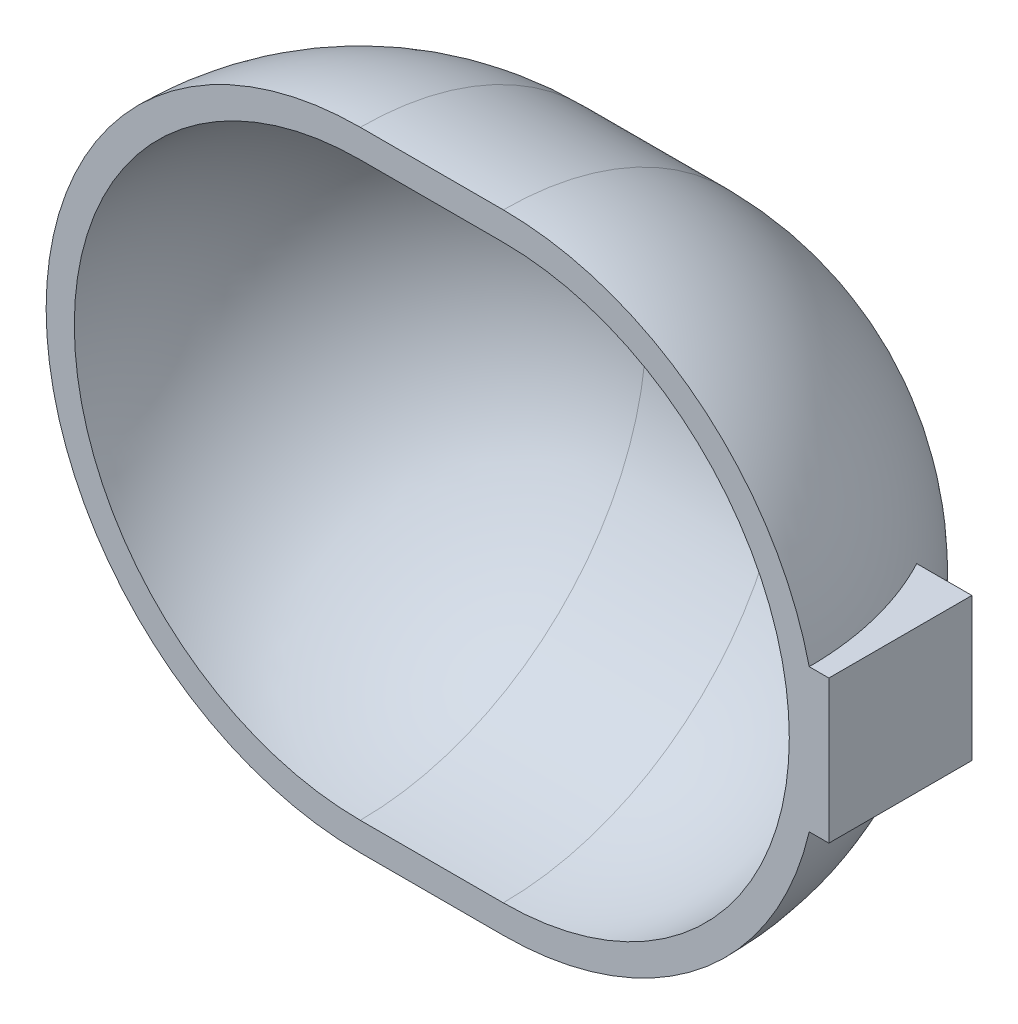
ISO-10303-21;
HEADER;
FILE_DESCRIPTION(('STEP AP214'),'2;1');
FILE_NAME('part.step','',(''),(''),'','','');
FILE_SCHEMA(('AUTOMOTIVE_DESIGN { 1 0 10303 214 1 1 1 1 }'));
ENDSEC;
DATA;
#1=APPLICATION_CONTEXT('core data for automotive mechanical design processes');
#2=APPLICATION_PROTOCOL_DEFINITION('international standard','automotive_design',2000,#1);
#3=PRODUCT_CONTEXT('',#1,'mechanical');
#4=PRODUCT('Part','Part','',(#3));
#5=PRODUCT_RELATED_PRODUCT_CATEGORY('part','',(#4));
#6=PRODUCT_DEFINITION_FORMATION('','',#4);
#7=PRODUCT_DEFINITION_CONTEXT('part definition',#1,'design');
#8=PRODUCT_DEFINITION('design','',#6,#7);
#9=PRODUCT_DEFINITION_SHAPE('','',#8);
#10=(LENGTH_UNIT() NAMED_UNIT(*) SI_UNIT(.MILLI.,.METRE.));
#11=(NAMED_UNIT(*) PLANE_ANGLE_UNIT() SI_UNIT($,.RADIAN.));
#12=(NAMED_UNIT(*) SI_UNIT($,.STERADIAN.) SOLID_ANGLE_UNIT());
#13=UNCERTAINTY_MEASURE_WITH_UNIT(LENGTH_MEASURE(1.E-05),#10,'distance_accuracy_value','');
#14=(GEOMETRIC_REPRESENTATION_CONTEXT(3) GLOBAL_UNCERTAINTY_ASSIGNED_CONTEXT((#13)) GLOBAL_UNIT_ASSIGNED_CONTEXT((#10,
#11,#12)) REPRESENTATION_CONTEXT('',''));
#15=CARTESIAN_POINT('',(0.,0.,0.));
#16=DIRECTION('',(0.,0.,1.));
#17=DIRECTION('',(1.,0.,0.));
#18=AXIS2_PLACEMENT_3D('',#15,#16,#17);
#19=CARTESIAN_POINT('',(533.,0.,0.));
#20=DIRECTION('',(-1.,0.,0.));
#21=DIRECTION('',(0.,1.,0.));
#22=AXIS2_PLACEMENT_3D('',#19,#20,#21);
#23=SPHERICAL_SURFACE('',#22,558.);
#24=CARTESIAN_POINT('',(533.,-127.,0.));
#25=DIRECTION('',(0.,-1.,0.));
#26=DIRECTION('',(0.,0.,-1.));
#27=AXIS2_PLACEMENT_3D('',#24,#25,#26);
#28=CIRCLE('',#27,543.355316528697);
#29=CARTESIAN_POINT('',(1013.33217672773,-127.,-254.));
#30=VERTEX_POINT('',#29);
#31=CARTESIAN_POINT('',(1076.3553165287,-127.,-8.86836260066156E-13));
#32=VERTEX_POINT('',#31);
#33=EDGE_CURVE('E125',#30,#32,#28,.T.);
#34=ORIENTED_EDGE('',*,*,#33,.T.);
#35=CARTESIAN_POINT('',(533.,0.,0.));
#36=DIRECTION('',(0.,0.,-1.));
#37=DIRECTION('',(1.,0.,0.));
#38=AXIS2_PLACEMENT_3D('',#35,#36,#37);
#39=CIRCLE('',#38,558.);
#40=CARTESIAN_POINT('',(533.,-558.,0.));
#41=VERTEX_POINT('',#40);
#42=EDGE_CURVE('E155',#32,#41,#39,.T.);
#43=ORIENTED_EDGE('',*,*,#42,.T.);
#44=CARTESIAN_POINT('',(533.,0.,0.));
#45=DIRECTION('',(-1.,0.,0.));
#46=DIRECTION('',(0.,0.,1.));
#47=AXIS2_PLACEMENT_3D('',#44,#45,#46);
#48=CIRCLE('',#47,558.);
#49=CARTESIAN_POINT('',(533.,558.,3.89649317414894E-12));
#50=VERTEX_POINT('',#49);
#51=EDGE_CURVE('E45',#50,#41,#48,.T.);
#52=ORIENTED_EDGE('',*,*,#51,.F.);
#53=CARTESIAN_POINT('',(1076.3553165287,127.,8.86836260066156E-13));
#54=VERTEX_POINT('',#53);
#55=EDGE_CURVE('E156',#50,#54,#39,.T.);
#56=ORIENTED_EDGE('',*,*,#55,.T.);
#57=CARTESIAN_POINT('',(533.,127.,0.));
#58=DIRECTION('',(0.,1.,0.));
#59=DIRECTION('',(0.,0.,1.));
#60=AXIS2_PLACEMENT_3D('',#57,#58,#59);
#61=CIRCLE('',#60,543.355316528697);
#62=CARTESIAN_POINT('',(1013.33217672773,127.,-254.));
#63=VERTEX_POINT('',#62);
#64=EDGE_CURVE('E57',#54,#63,#61,.T.);
#65=ORIENTED_EDGE('',*,*,#64,.T.);
#66=CARTESIAN_POINT('',(533.,0.,-254.));
#67=DIRECTION('',(0.,0.,-1.));
#68=DIRECTION('',(0.,1.,0.));
#69=AXIS2_PLACEMENT_3D('',#66,#67,#68);
#70=CIRCLE('',#69,496.838001767176);
#71=EDGE_CURVE('E52',#63,#30,#70,.T.);
#72=ORIENTED_EDGE('',*,*,#71,.T.);
#73=EDGE_LOOP('',(#34,#43,#52,#56,#65,#72));
#74=FACE_BOUND('',#73,.T.);
#75=ADVANCED_FACE('F37',(#74),#23,.T.);
#76=CARTESIAN_POINT('',(279.,0.,0.));
#77=DIRECTION('',(-1.,0.,0.));
#78=DIRECTION('',(0.,-1.,0.));
#79=AXIS2_PLACEMENT_3D('',#76,#77,#78);
#80=SPHERICAL_SURFACE('',#79,558.);
#81=CARTESIAN_POINT('',(279.,0.,0.));
#82=DIRECTION('',(-1.,0.,0.));
#83=DIRECTION('',(0.,0.,1.));
#84=AXIS2_PLACEMENT_3D('',#81,#82,#83);
#85=CIRCLE('',#84,558.);
#86=CARTESIAN_POINT('',(279.,558.,3.89649317414894E-12));
#87=VERTEX_POINT('',#86);
#88=CARTESIAN_POINT('',(279.,-558.,0.));
#89=VERTEX_POINT('',#88);
#90=EDGE_CURVE('E11',#87,#89,#85,.T.);
#91=ORIENTED_EDGE('',*,*,#90,.T.);
#92=CARTESIAN_POINT('',(279.,0.,0.));
#93=DIRECTION('',(0.,0.,-1.));
#94=DIRECTION('',(1.,0.,0.));
#95=AXIS2_PLACEMENT_3D('',#92,#93,#94);
#96=CIRCLE('',#95,558.);
#97=EDGE_CURVE('E158',#89,#87,#96,.T.);
#98=ORIENTED_EDGE('',*,*,#97,.T.);
#99=EDGE_LOOP('',(#91,#98));
#100=FACE_BOUND('',#99,.T.);
#101=ADVANCED_FACE('F39',(#100),#80,.T.);
#102=CARTESIAN_POINT('',(533.,0.,0.));
#103=DIRECTION('',(-1.,0.,0.));
#104=DIRECTION('',(0.,0.,1.));
#105=AXIS2_PLACEMENT_3D('',#102,#103,#104);
#106=CYLINDRICAL_SURFACE('',#105,558.);
#107=DIRECTION('',(1.,0.,0.));
#108=VECTOR('',#107,1.);
#109=CARTESIAN_POINT('',(279.,558.,3.89649317414894E-12));
#110=LINE('',#109,#108);
#111=EDGE_CURVE('E161',#87,#50,#110,.T.);
#112=ORIENTED_EDGE('',*,*,#111,.T.);
#113=ORIENTED_EDGE('',*,*,#51,.T.);
#114=DIRECTION('',(1.,0.,0.));
#115=VECTOR('',#114,1.);
#116=CARTESIAN_POINT('',(279.,-558.,0.));
#117=LINE('',#116,#115);
#118=EDGE_CURVE('E142',#89,#41,#117,.T.);
#119=ORIENTED_EDGE('',*,*,#118,.F.);
#120=ORIENTED_EDGE('',*,*,#90,.F.);
#121=EDGE_LOOP('',(#112,#113,#119,#120));
#122=FACE_BOUND('',#121,.T.);
#123=ADVANCED_FACE('F166',(#122),#106,.T.);
#124=CARTESIAN_POINT('',(533.,0.,0.));
#125=DIRECTION('',(0.,0.,-1.));
#126=DIRECTION('',(1.,0.,0.));
#127=AXIS2_PLACEMENT_3D('',#124,#125,#126);
#128=PLANE('',#127);
#129=DIRECTION('',(-1.,0.,0.));
#130=VECTOR('',#129,1.);
#131=CARTESIAN_POINT('',(279.,508.,3.52786446705774E-12));
#132=LINE('',#131,#130);
#133=CARTESIAN_POINT('',(279.,508.,3.52786446705774E-12));
#134=VERTEX_POINT('',#133);
#135=CARTESIAN_POINT('',(533.,508.,3.54734504026462E-12));
#136=VERTEX_POINT('',#135);
#137=EDGE_CURVE('E140',#134,#136,#132,.F.);
#138=ORIENTED_EDGE('',*,*,#137,.T.);
#139=CARTESIAN_POINT('',(533.,0.,0.));
#140=DIRECTION('',(0.,0.,-1.));
#141=DIRECTION('',(0.,1.,0.));
#142=AXIS2_PLACEMENT_3D('',#139,#140,#141);
#143=CIRCLE('',#142,508.);
#144=CARTESIAN_POINT('',(533.,-508.,-2.25597318603832E-13));
#145=VERTEX_POINT('',#144);
#146=EDGE_CURVE('E143',#136,#145,#143,.T.);
#147=ORIENTED_EDGE('',*,*,#146,.T.);
#148=DIRECTION('',(-1.,0.,0.));
#149=VECTOR('',#148,1.);
#150=CARTESIAN_POINT('',(279.,-508.,0.));
#151=LINE('',#150,#149);
#152=CARTESIAN_POINT('',(279.,-508.,0.));
#153=VERTEX_POINT('',#152);
#154=EDGE_CURVE('E136',#153,#145,#151,.F.);
#155=ORIENTED_EDGE('',*,*,#154,.F.);
#156=CARTESIAN_POINT('',(279.,0.,0.));
#157=DIRECTION('',(0.,0.,-1.));
#158=DIRECTION('',(0.,1.,0.));
#159=AXIS2_PLACEMENT_3D('',#156,#157,#158);
#160=CIRCLE('',#159,508.);
#161=EDGE_CURVE('E146',#153,#134,#160,.T.);
#162=ORIENTED_EDGE('',*,*,#161,.T.);
#163=EDGE_LOOP('',(#138,#147,#155,#162));
#164=FACE_BOUND('',#163,.T.);
#165=ORIENTED_EDGE('',*,*,#55,.F.);
#166=ORIENTED_EDGE('',*,*,#111,.F.);
#167=ORIENTED_EDGE('',*,*,#97,.F.);
#168=ORIENTED_EDGE('',*,*,#118,.T.);
#169=ORIENTED_EDGE('',*,*,#42,.F.);
#170=DIRECTION('',(1.,0.,0.));
#171=VECTOR('',#170,1.);
#172=CARTESIAN_POINT('',(-279.001,-127.,0.));
#173=LINE('',#172,#171);
#174=CARTESIAN_POINT('',(1111.26,-127.,0.));
#175=VERTEX_POINT('',#174);
#176=EDGE_CURVE('E132',#32,#175,#173,.T.);
#177=ORIENTED_EDGE('',*,*,#176,.T.);
#178=DIRECTION('',(0.,-1.,0.));
#179=VECTOR('',#178,1.);
#180=CARTESIAN_POINT('',(1111.26,-127.,0.));
#181=LINE('',#180,#179);
#182=CARTESIAN_POINT('',(1111.26,127.,0.));
#183=VERTEX_POINT('',#182);
#184=EDGE_CURVE('E119',#183,#175,#181,.T.);
#185=ORIENTED_EDGE('',*,*,#184,.F.);
#186=DIRECTION('',(1.,0.,0.));
#187=VECTOR('',#186,1.);
#188=CARTESIAN_POINT('',(-279.001,127.,0.));
#189=LINE('',#188,#187);
#190=EDGE_CURVE('E109',#54,#183,#189,.T.);
#191=ORIENTED_EDGE('',*,*,#190,.F.);
#192=EDGE_LOOP('',(#165,#166,#167,#168,#169,#177,#185,#191));
#193=FACE_BOUND('',#192,.T.);
#194=ADVANCED_FACE('F170',(#164,#193),#128,.F.);
#195=CARTESIAN_POINT('',(533.,0.,0.));
#196=DIRECTION('',(-1.,0.,0.));
#197=DIRECTION('',(0.,1.,0.));
#198=AXIS2_PLACEMENT_3D('',#195,#196,#197);
#199=SPHERICAL_SURFACE('',#198,508.);
#200=ORIENTED_EDGE('',*,*,#146,.F.);
#201=CARTESIAN_POINT('',(533.,0.,0.));
#202=DIRECTION('',(-1.,0.,0.));
#203=DIRECTION('',(0.,0.,1.));
#204=AXIS2_PLACEMENT_3D('',#201,#202,#203);
#205=CIRCLE('',#204,508.);
#206=EDGE_CURVE('E137',#136,#145,#205,.T.);
#207=ORIENTED_EDGE('',*,*,#206,.T.);
#208=EDGE_LOOP('',(#200,#207));
#209=FACE_BOUND('',#208,.T.);
#210=ADVANCED_FACE('F183',(#209),#199,.F.);
#211=CARTESIAN_POINT('',(279.,0.,0.));
#212=DIRECTION('',(-1.,0.,0.));
#213=DIRECTION('',(0.,-1.,0.));
#214=AXIS2_PLACEMENT_3D('',#211,#212,#213);
#215=SPHERICAL_SURFACE('',#214,508.);
#216=CARTESIAN_POINT('',(279.,0.,0.));
#217=DIRECTION('',(-1.,0.,0.));
#218=DIRECTION('',(0.,0.,1.));
#219=AXIS2_PLACEMENT_3D('',#216,#217,#218);
#220=CIRCLE('',#219,508.);
#221=EDGE_CURVE('E139',#134,#153,#220,.T.);
#222=ORIENTED_EDGE('',*,*,#221,.F.);
#223=ORIENTED_EDGE('',*,*,#161,.F.);
#224=EDGE_LOOP('',(#222,#223));
#225=FACE_BOUND('',#224,.T.);
#226=ADVANCED_FACE('F188',(#225),#215,.F.);
#227=CARTESIAN_POINT('',(533.,0.,0.));
#228=DIRECTION('',(-1.,0.,0.));
#229=DIRECTION('',(0.,0.,1.));
#230=AXIS2_PLACEMENT_3D('',#227,#228,#229);
#231=CYLINDRICAL_SURFACE('',#230,508.);
#232=ORIENTED_EDGE('',*,*,#137,.F.);
#233=ORIENTED_EDGE('',*,*,#221,.T.);
#234=ORIENTED_EDGE('',*,*,#154,.T.);
#235=ORIENTED_EDGE('',*,*,#206,.F.);
#236=EDGE_LOOP('',(#232,#233,#234,#235));
#237=FACE_BOUND('',#236,.T.);
#238=ADVANCED_FACE('F185',(#237),#231,.F.);
#239=CARTESIAN_POINT('',(-279.001,-127.,-254.));
#240=DIRECTION('',(0.,0.,-1.));
#241=DIRECTION('',(0.,1.,0.));
#242=AXIS2_PLACEMENT_3D('',#239,#240,#241);
#243=PLANE('',#242);
#244=ORIENTED_EDGE('',*,*,#71,.F.);
#245=DIRECTION('',(1.,0.,0.));
#246=VECTOR('',#245,1.);
#247=CARTESIAN_POINT('',(-279.001,127.,-254.));
#248=LINE('',#247,#246);
#249=CARTESIAN_POINT('',(1111.26,127.,-254.));
#250=VERTEX_POINT('',#249);
#251=EDGE_CURVE('E101',#63,#250,#248,.T.);
#252=ORIENTED_EDGE('',*,*,#251,.T.);
#253=DIRECTION('',(0.,1.,0.));
#254=VECTOR('',#253,1.);
#255=CARTESIAN_POINT('',(1111.26,-127.,-254.));
#256=LINE('',#255,#254);
#257=CARTESIAN_POINT('',(1111.26,-127.,-254.));
#258=VERTEX_POINT('',#257);
#259=EDGE_CURVE('E106',#258,#250,#256,.T.);
#260=ORIENTED_EDGE('',*,*,#259,.F.);
#261=DIRECTION('',(1.,0.,0.));
#262=VECTOR('',#261,1.);
#263=CARTESIAN_POINT('',(-279.001,-127.,-254.));
#264=LINE('',#263,#262);
#265=EDGE_CURVE('E130',#30,#258,#264,.T.);
#266=ORIENTED_EDGE('',*,*,#265,.F.);
#267=EDGE_LOOP('',(#244,#252,#260,#266));
#268=FACE_BOUND('',#267,.T.);
#269=ADVANCED_FACE('F103',(#268),#243,.T.);
#270=CARTESIAN_POINT('',(-279.001,-127.,0.));
#271=DIRECTION('',(0.,-1.,0.));
#272=DIRECTION('',(0.,0.,-1.));
#273=AXIS2_PLACEMENT_3D('',#270,#271,#272);
#274=PLANE('',#273);
#275=ORIENTED_EDGE('',*,*,#33,.F.);
#276=ORIENTED_EDGE('',*,*,#265,.T.);
#277=DIRECTION('',(0.,0.,-1.));
#278=VECTOR('',#277,1.);
#279=CARTESIAN_POINT('',(1111.26,-127.,0.));
#280=LINE('',#279,#278);
#281=EDGE_CURVE('E110',#175,#258,#280,.T.);
#282=ORIENTED_EDGE('',*,*,#281,.F.);
#283=ORIENTED_EDGE('',*,*,#176,.F.);
#284=EDGE_LOOP('',(#275,#276,#282,#283));
#285=FACE_BOUND('',#284,.T.);
#286=ADVANCED_FACE('F198',(#285),#274,.T.);
#287=CARTESIAN_POINT('',(-279.001,127.,0.));
#288=DIRECTION('',(0.,1.,0.));
#289=DIRECTION('',(0.,0.,1.));
#290=AXIS2_PLACEMENT_3D('',#287,#288,#289);
#291=PLANE('',#290);
#292=ORIENTED_EDGE('',*,*,#64,.F.);
#293=ORIENTED_EDGE('',*,*,#190,.T.);
#294=DIRECTION('',(0.,0.,1.));
#295=VECTOR('',#294,1.);
#296=CARTESIAN_POINT('',(1111.26,127.,0.));
#297=LINE('',#296,#295);
#298=EDGE_CURVE('E113',#250,#183,#297,.T.);
#299=ORIENTED_EDGE('',*,*,#298,.F.);
#300=ORIENTED_EDGE('',*,*,#251,.F.);
#301=EDGE_LOOP('',(#292,#293,#299,#300));
#302=FACE_BOUND('',#301,.T.);
#303=ADVANCED_FACE('F114',(#302),#291,.T.);
#304=CARTESIAN_POINT('',(1111.26,0.,0.));
#305=DIRECTION('',(-1.,0.,0.));
#306=DIRECTION('',(0.,0.,1.));
#307=AXIS2_PLACEMENT_3D('',#304,#305,#306);
#308=PLANE('',#307);
#309=ORIENTED_EDGE('',*,*,#259,.T.);
#310=ORIENTED_EDGE('',*,*,#298,.T.);
#311=ORIENTED_EDGE('',*,*,#184,.T.);
#312=ORIENTED_EDGE('',*,*,#281,.T.);
#313=EDGE_LOOP('',(#309,#310,#311,#312));
#314=FACE_BOUND('',#313,.T.);
#315=ADVANCED_FACE('F121',(#314),#308,.F.);
#316=CLOSED_SHELL('',(#75,#101,#123,#194,#210,#226,#238,#269,#286,#303,#315));
#317=MANIFOLD_SOLID_BREP('B2',#316);
#318=ADVANCED_BREP_SHAPE_REPRESENTATION('',(#18,#317),#14);
#319=SHAPE_DEFINITION_REPRESENTATION(#9,#318);
ENDSEC;
END-ISO-10303-21;
